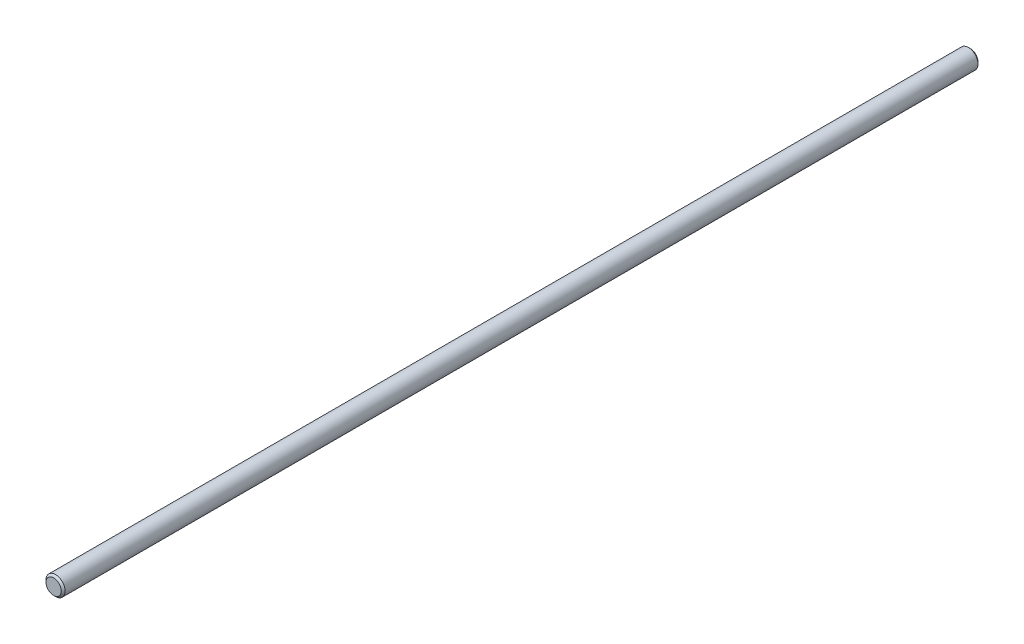
ISO-10303-21;
HEADER;
FILE_DESCRIPTION(('STEP AP214'),'2;1');
FILE_NAME('part.step','',(''),(''),'','','');
FILE_SCHEMA(('AUTOMOTIVE_DESIGN { 1 0 10303 214 1 1 1 1 }'));
ENDSEC;
DATA;
#1=APPLICATION_CONTEXT('core data for automotive mechanical design processes');
#2=APPLICATION_PROTOCOL_DEFINITION('international standard','automotive_design',2000,#1);
#3=PRODUCT_CONTEXT('',#1,'mechanical');
#4=PRODUCT('Part','Part','',(#3));
#5=PRODUCT_RELATED_PRODUCT_CATEGORY('part','',(#4));
#6=PRODUCT_DEFINITION_FORMATION('','',#4);
#7=PRODUCT_DEFINITION_CONTEXT('part definition',#1,'design');
#8=PRODUCT_DEFINITION('design','',#6,#7);
#9=PRODUCT_DEFINITION_SHAPE('','',#8);
#10=(LENGTH_UNIT() NAMED_UNIT(*) SI_UNIT(.MILLI.,.METRE.));
#11=(NAMED_UNIT(*) PLANE_ANGLE_UNIT() SI_UNIT($,.RADIAN.));
#12=(NAMED_UNIT(*) SI_UNIT($,.STERADIAN.) SOLID_ANGLE_UNIT());
#13=UNCERTAINTY_MEASURE_WITH_UNIT(LENGTH_MEASURE(1.E-05),#10,'distance_accuracy_value','');
#14=(GEOMETRIC_REPRESENTATION_CONTEXT(3) GLOBAL_UNCERTAINTY_ASSIGNED_CONTEXT((#13)) GLOBAL_UNIT_ASSIGNED_CONTEXT((#10,
#11,#12)) REPRESENTATION_CONTEXT('',''));
#15=CARTESIAN_POINT('',(0.,0.,0.));
#16=DIRECTION('',(0.,0.,1.));
#17=DIRECTION('',(1.,0.,0.));
#18=AXIS2_PLACEMENT_3D('',#15,#16,#17);
#19=CARTESIAN_POINT('',(0.,0.,76.2));
#20=DIRECTION('',(0.,0.,-1.));
#21=DIRECTION('',(-1.,0.,0.));
#22=AXIS2_PLACEMENT_3D('',#19,#20,#21);
#23=CYLINDRICAL_SURFACE('',#22,1.5875);
#24=CARTESIAN_POINT('',(0.,0.,-75.8824999999998));
#25=DIRECTION('',(0.,0.,1.));
#26=DIRECTION('',(1.,0.,0.));
#27=AXIS2_PLACEMENT_3D('',#24,#25,#26);
#28=CIRCLE('',#27,1.5875);
#29=CARTESIAN_POINT('',(-1.5875,0.,-75.8824999999999));
#30=VERTEX_POINT('',#29);
#31=EDGE_CURVE('E43',#30,#30,#28,.T.);
#32=CARTESIAN_POINT('',(0.,0.,75.8825000000001));
#33=DIRECTION('',(0.,0.,1.));
#34=DIRECTION('',(1.,0.,0.));
#35=AXIS2_PLACEMENT_3D('',#32,#33,#34);
#36=CIRCLE('',#35,1.5875);
#37=CARTESIAN_POINT('',(-1.5875,0.,75.8825000000001));
#38=VERTEX_POINT('',#37);
#39=EDGE_CURVE('E47',#38,#38,#36,.F.);
#40=CARTESIAN_POINT('',(-1.5875,0.,-75.8824999999999));
#41=CARTESIAN_POINT('',(-1.5875,0.,-74.3016145833332));
#42=CARTESIAN_POINT('',(-1.5875,0.,-72.7207291666665));
#43=CARTESIAN_POINT('',(-1.5875,0.,-69.5589583333332));
#44=CARTESIAN_POINT('',(-1.5875,0.,-67.9780729166665));
#45=CARTESIAN_POINT('',(-1.5875,0.,-64.8163020833332));
#46=CARTESIAN_POINT('',(-1.5875,0.,-63.2354166666665));
#47=CARTESIAN_POINT('',(-1.5875,0.,-60.0736458333332));
#48=CARTESIAN_POINT('',(-1.5875,0.,-58.4927604166665));
#49=CARTESIAN_POINT('',(-1.5875,0.,-55.3309895833332));
#50=CARTESIAN_POINT('',(-1.5875,0.,-53.7501041666665));
#51=CARTESIAN_POINT('',(-1.5875,0.,-50.5883333333332));
#52=CARTESIAN_POINT('',(-1.5875,0.,-49.0074479166665));
#53=CARTESIAN_POINT('',(-1.5875,0.,-45.8456770833332));
#54=CARTESIAN_POINT('',(-1.5875,0.,-44.2647916666665));
#55=CARTESIAN_POINT('',(-1.5875,0.,-41.1030208333332));
#56=CARTESIAN_POINT('',(-1.5875,0.,-39.5221354166665));
#57=CARTESIAN_POINT('',(-1.5875,0.,-36.3603645833332));
#58=CARTESIAN_POINT('',(-1.5875,0.,-34.7794791666665));
#59=CARTESIAN_POINT('',(-1.5875,0.,-31.6177083333332));
#60=CARTESIAN_POINT('',(-1.5875,0.,-30.0368229166665));
#61=CARTESIAN_POINT('',(-1.5875,0.,-26.8750520833332));
#62=CARTESIAN_POINT('',(-1.5875,0.,-25.2941666666665));
#63=CARTESIAN_POINT('',(-1.5875,0.,-22.1323958333332));
#64=CARTESIAN_POINT('',(-1.5875,0.,-20.5515104166665));
#65=CARTESIAN_POINT('',(-1.5875,0.,-17.3897395833332));
#66=CARTESIAN_POINT('',(-1.5875,0.,-15.8088541666665));
#67=CARTESIAN_POINT('',(-1.5875,0.,-12.6470833333332));
#68=CARTESIAN_POINT('',(-1.5875,0.,-11.0661979166665));
#69=CARTESIAN_POINT('',(-1.5875,0.,-7.90442708333321));
#70=CARTESIAN_POINT('',(-1.5875,0.,-6.32354166666654));
#71=CARTESIAN_POINT('',(-1.5875,0.,-3.16177083333321));
#72=CARTESIAN_POINT('',(-1.5875,0.,-1.58088541666654));
#73=CARTESIAN_POINT('',(-1.5875,0.,1.58088541666679));
#74=CARTESIAN_POINT('',(-1.5875,0.,3.16177083333346));
#75=CARTESIAN_POINT('',(-1.5875,0.,6.32354166666679));
#76=CARTESIAN_POINT('',(-1.5875,0.,7.90442708333346));
#77=CARTESIAN_POINT('',(-1.5875,0.,11.0661979166668));
#78=CARTESIAN_POINT('',(-1.5875,0.,12.6470833333335));
#79=CARTESIAN_POINT('',(-1.5875,0.,15.8088541666668));
#80=CARTESIAN_POINT('',(-1.5875,0.,17.3897395833335));
#81=CARTESIAN_POINT('',(-1.5875,0.,20.5515104166668));
#82=CARTESIAN_POINT('',(-1.5875,0.,22.1323958333335));
#83=CARTESIAN_POINT('',(-1.5875,0.,25.2941666666668));
#84=CARTESIAN_POINT('',(-1.5875,0.,26.8750520833335));
#85=CARTESIAN_POINT('',(-1.5875,0.,30.0368229166668));
#86=CARTESIAN_POINT('',(-1.5875,0.,31.6177083333335));
#87=CARTESIAN_POINT('',(-1.5875,0.,34.7794791666668));
#88=CARTESIAN_POINT('',(-1.5875,0.,36.3603645833334));
#89=CARTESIAN_POINT('',(-1.5875,0.,39.5221354166668));
#90=CARTESIAN_POINT('',(-1.5875,0.,41.1030208333334));
#91=CARTESIAN_POINT('',(-1.5875,0.,44.2647916666668));
#92=CARTESIAN_POINT('',(-1.5875,0.,45.8456770833335));
#93=CARTESIAN_POINT('',(-1.5875,0.,49.0074479166668));
#94=CARTESIAN_POINT('',(-1.5875,0.,50.5883333333335));
#95=CARTESIAN_POINT('',(-1.5875,0.,53.7501041666668));
#96=CARTESIAN_POINT('',(-1.5875,0.,55.3309895833335));
#97=CARTESIAN_POINT('',(-1.5875,0.,58.4927604166668));
#98=CARTESIAN_POINT('',(-1.5875,0.,60.0736458333334));
#99=CARTESIAN_POINT('',(-1.5875,0.,63.2354166666668));
#100=CARTESIAN_POINT('',(-1.5875,0.,64.8163020833334));
#101=CARTESIAN_POINT('',(-1.5875,0.,67.9780729166668));
#102=CARTESIAN_POINT('',(-1.5875,0.,69.5589583333335));
#103=CARTESIAN_POINT('',(-1.5875,0.,72.7207291666668));
#104=CARTESIAN_POINT('',(-1.5875,0.,74.3016145833334));
#105=CARTESIAN_POINT('',(-1.5875,0.,75.8825000000001));
#106=B_SPLINE_CURVE_WITH_KNOTS('',3,(#40,#41,#42,#43,#44,#45,#46,#47,#48,#49,#50,#51,#52,#53,
#54,#55,#56,#57,#58,#59,#60,#61,#62,#63,#64,#65,#66,#67,#68,#69,#70,#71,#72,#73,#74,#75,#76,#77,
#78,#79,#80,#81,#82,#83,#84,#85,#86,#87,#88,#89,#90,#91,#92,#93,#94,#95,#96,#97,#98,#99,#100,
#101,#102,#103,#104,#105),.UNSPECIFIED.,.F.,.F.,(4,2,2,2,2,2,2,2,2,2,2,2,2,2,2,2,2,2,2,2,2,2,2,
2,2,2,2,2,2,2,2,2,4),(0.,4.74265625,9.48531250000001,14.22796875,18.970625,23.71328125,
28.4559375,33.19859375,37.94125,42.68390625,47.4265625,52.16921875,56.911875,61.65453125,
66.3971875,71.13984375,75.8825,80.62515625,85.3678125,90.11046875,94.853125,99.59578125,
104.3384375,109.08109375,113.82375,118.56640625,123.3090625,128.05171875,132.794375,
137.53703125,142.2796875,147.02234375,151.765),.UNSPECIFIED.);
#107=EDGE_CURVE('BSEAM32',#30,#38,#106,.T.);
#108=ORIENTED_EDGE('',*,*,#31,.T.);
#109=ORIENTED_EDGE('',*,*,#39,.T.);
#110=ORIENTED_EDGE('',*,*,#107,.T.);
#111=ORIENTED_EDGE('',*,*,#107,.F.);
#112=EDGE_LOOP('',(#108,#110,#109,#111));
#113=FACE_BOUND('',#112,.T.);
#114=ADVANCED_FACE('F32',(#113),#23,.T.);
#115=CARTESIAN_POINT('',(0.,0.,76.2));
#116=DIRECTION('',(0.,0.,1.));
#117=DIRECTION('',(1.,0.,0.));
#118=AXIS2_PLACEMENT_3D('',#115,#116,#117);
#119=PLANE('',#118);
#120=CARTESIAN_POINT('',(0.,0.,76.2));
#121=DIRECTION('',(0.,0.,1.));
#122=DIRECTION('',(1.,0.,0.));
#123=AXIS2_PLACEMENT_3D('',#120,#121,#122);
#124=CIRCLE('',#123,1.27000000000012);
#125=CARTESIAN_POINT('',(1.27000000000012,0.,76.2));
#126=VERTEX_POINT('',#125);
#127=EDGE_CURVE('E10',#126,#126,#124,.T.);
#128=ORIENTED_EDGE('',*,*,#127,.T.);
#129=EDGE_LOOP('',(#128));
#130=FACE_BOUND('',#129,.T.);
#131=ADVANCED_FACE('F63',(#130),#119,.T.);
#132=CARTESIAN_POINT('',(0.,0.,-76.2));
#133=DIRECTION('',(0.,0.,1.));
#134=DIRECTION('',(1.,0.,0.));
#135=AXIS2_PLACEMENT_3D('',#132,#133,#134);
#136=PLANE('',#135);
#137=CARTESIAN_POINT('',(0.,0.,-76.2));
#138=DIRECTION('',(0.,0.,1.));
#139=DIRECTION('',(1.,0.,0.));
#140=AXIS2_PLACEMENT_3D('',#137,#138,#139);
#141=CIRCLE('',#140,1.26999999999983);
#142=CARTESIAN_POINT('',(1.26999999999983,0.,-76.2));
#143=VERTEX_POINT('',#142);
#144=EDGE_CURVE('E39',#143,#143,#141,.F.);
#145=ORIENTED_EDGE('',*,*,#144,.T.);
#146=EDGE_LOOP('',(#145));
#147=FACE_BOUND('',#146,.T.);
#148=ADVANCED_FACE('F60',(#147),#136,.F.);
#149=CARTESIAN_POINT('',(0.,0.,-75.8824999999998));
#150=DIRECTION('',(0.,0.,1.));
#151=DIRECTION('',(1.,0.,0.));
#152=AXIS2_PLACEMENT_3D('',#149,#150,#151);
#153=CONICAL_SURFACE('',#152,1.5875,0.785398163397462);
#154=ORIENTED_EDGE('',*,*,#144,.F.);
#155=EDGE_LOOP('',(#154));
#156=FACE_BOUND('',#155,.T.);
#157=ORIENTED_EDGE('',*,*,#31,.F.);
#158=EDGE_LOOP('',(#157));
#159=FACE_BOUND('',#158,.T.);
#160=ADVANCED_FACE('F56',(#156,#159),#153,.T.);
#161=CARTESIAN_POINT('',(0.,0.,76.2));
#162=DIRECTION('',(0.,0.,-1.));
#163=DIRECTION('',(-1.,0.,0.));
#164=AXIS2_PLACEMENT_3D('',#161,#162,#163);
#165=CONICAL_SURFACE('',#164,1.27000000000012,0.78539816339744);
#166=ORIENTED_EDGE('',*,*,#39,.F.);
#167=EDGE_LOOP('',(#166));
#168=FACE_BOUND('',#167,.T.);
#169=ORIENTED_EDGE('',*,*,#127,.F.);
#170=EDGE_LOOP('',(#169));
#171=FACE_BOUND('',#170,.T.);
#172=ADVANCED_FACE('F34',(#168,#171),#165,.T.);
#173=CLOSED_SHELL('',(#114,#131,#148,#160,#172));
#174=MANIFOLD_SOLID_BREP('B2',#173);
#175=ADVANCED_BREP_SHAPE_REPRESENTATION('',(#18,#174),#14);
#176=SHAPE_DEFINITION_REPRESENTATION(#9,#175);
ENDSEC;
END-ISO-10303-21;
